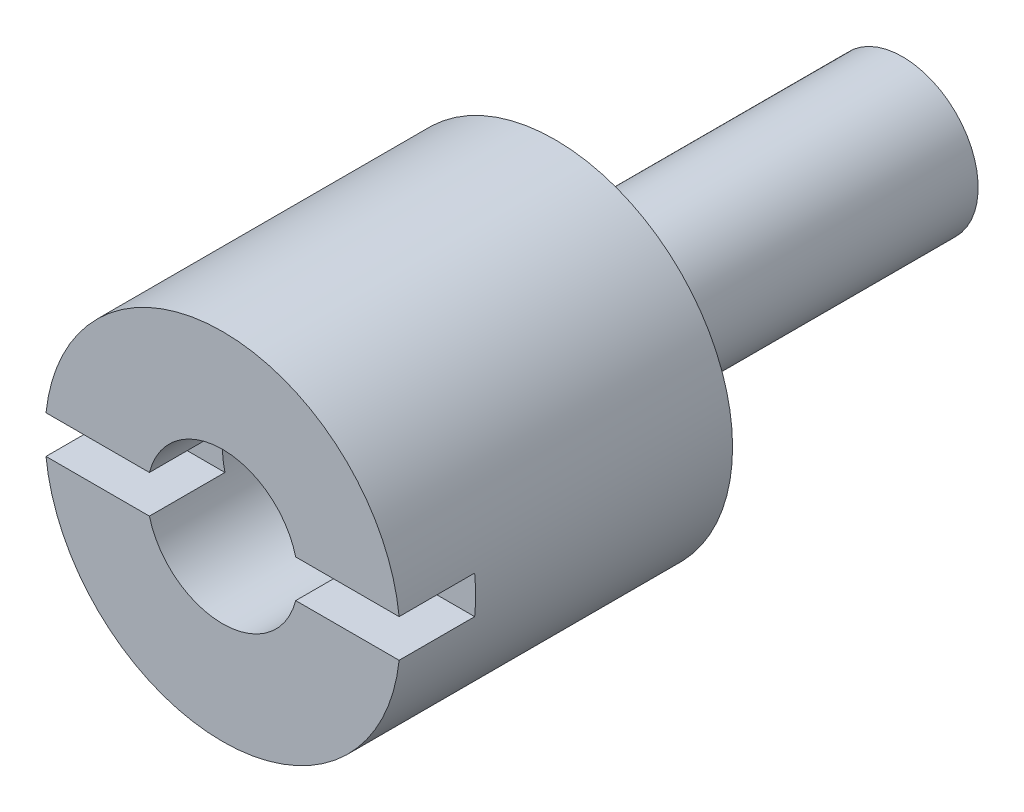
ISO-10303-21;
HEADER;
FILE_DESCRIPTION(('STEP AP214'),'2;1');
FILE_NAME('part.step','',(''),(''),'','','');
FILE_SCHEMA(('AUTOMOTIVE_DESIGN { 1 0 10303 214 1 1 1 1 }'));
ENDSEC;
DATA;
#1=APPLICATION_CONTEXT('core data for automotive mechanical design processes');
#2=APPLICATION_PROTOCOL_DEFINITION('international standard','automotive_design',2000,#1);
#3=PRODUCT_CONTEXT('',#1,'mechanical');
#4=PRODUCT('Part','Part','',(#3));
#5=PRODUCT_RELATED_PRODUCT_CATEGORY('part','',(#4));
#6=PRODUCT_DEFINITION_FORMATION('','',#4);
#7=PRODUCT_DEFINITION_CONTEXT('part definition',#1,'design');
#8=PRODUCT_DEFINITION('design','',#6,#7);
#9=PRODUCT_DEFINITION_SHAPE('','',#8);
#10=(LENGTH_UNIT() NAMED_UNIT(*) SI_UNIT(.MILLI.,.METRE.));
#11=(NAMED_UNIT(*) PLANE_ANGLE_UNIT() SI_UNIT($,.RADIAN.));
#12=(NAMED_UNIT(*) SI_UNIT($,.STERADIAN.) SOLID_ANGLE_UNIT());
#13=UNCERTAINTY_MEASURE_WITH_UNIT(LENGTH_MEASURE(1.E-05),#10,'distance_accuracy_value','');
#14=(GEOMETRIC_REPRESENTATION_CONTEXT(3) GLOBAL_UNCERTAINTY_ASSIGNED_CONTEXT((#13)) GLOBAL_UNIT_ASSIGNED_CONTEXT((#10,
#11,#12)) REPRESENTATION_CONTEXT('',''));
#15=CARTESIAN_POINT('',(0.,0.,0.));
#16=DIRECTION('',(0.,0.,1.));
#17=DIRECTION('',(1.,0.,0.));
#18=AXIS2_PLACEMENT_3D('',#15,#16,#17);
#19=CARTESIAN_POINT('',(0.,0.,-4.6));
#20=DIRECTION('',(0.,0.,1.));
#21=DIRECTION('',(1.,0.,0.));
#22=AXIS2_PLACEMENT_3D('',#19,#20,#21);
#23=CYLINDRICAL_SURFACE('',#22,1.);
#24=CARTESIAN_POINT('',(0.,0.,-4.6));
#25=DIRECTION('',(0.,0.,-1.));
#26=DIRECTION('',(-1.,0.,0.));
#27=AXIS2_PLACEMENT_3D('',#24,#25,#26);
#28=CIRCLE('',#27,1.);
#29=CARTESIAN_POINT('',(-1.,0.,-4.6));
#30=VERTEX_POINT('',#29);
#31=EDGE_CURVE('E11',#30,#30,#28,.T.);
#32=ORIENTED_EDGE('',*,*,#31,.F.);
#33=EDGE_LOOP('',(#32));
#34=FACE_BOUND('',#33,.T.);
#35=CARTESIAN_POINT('',(0.,0.,0.));
#36=DIRECTION('',(0.,0.,-1.));
#37=DIRECTION('',(-1.,0.,0.));
#38=AXIS2_PLACEMENT_3D('',#35,#36,#37);
#39=CIRCLE('',#38,1.);
#40=CARTESIAN_POINT('',(-1.,0.,0.));
#41=VERTEX_POINT('',#40);
#42=EDGE_CURVE('E46',#41,#41,#39,.T.);
#43=ORIENTED_EDGE('',*,*,#42,.T.);
#44=EDGE_LOOP('',(#43));
#45=FACE_BOUND('',#44,.T.);
#46=ADVANCED_FACE('F43',(#34,#45),#23,.T.);
#47=CARTESIAN_POINT('',(0.,0.,-4.6));
#48=DIRECTION('',(0.,0.,-1.));
#49=DIRECTION('',(-1.,0.,0.));
#50=AXIS2_PLACEMENT_3D('',#47,#48,#49);
#51=PLANE('',#50);
#52=ORIENTED_EDGE('',*,*,#31,.T.);
#53=EDGE_LOOP('',(#52));
#54=FACE_BOUND('',#53,.T.);
#55=ADVANCED_FACE('F58',(#54),#51,.T.);
#56=CARTESIAN_POINT('',(0.,0.,0.));
#57=DIRECTION('',(0.,0.,-1.));
#58=DIRECTION('',(-1.,0.,0.));
#59=AXIS2_PLACEMENT_3D('',#56,#57,#58);
#60=PLANE('',#59);
#61=ORIENTED_EDGE('',*,*,#42,.F.);
#62=EDGE_LOOP('',(#61));
#63=FACE_BOUND('',#62,.T.);
#64=ADVANCED_FACE('F56',(#63),#60,.F.);
#65=CLOSED_SHELL('',(#46,#55,#64));
#66=MANIFOLD_SOLID_BREP('B2',#65);
#67=CARTESIAN_POINT('',(0.,0.,4.4));
#68=DIRECTION('',(0.,0.,1.));
#69=DIRECTION('',(1.,0.,0.));
#70=AXIS2_PLACEMENT_3D('',#67,#68,#69);
#71=PLANE('',#70);
#72=DIRECTION('',(-1.,0.,0.));
#73=VECTOR('',#72,1.);
#74=CARTESIAN_POINT('',(-2.5,0.25,4.4));
#75=LINE('',#74,#73);
#76=CARTESIAN_POINT('',(2.33666428910958,0.25,4.4));
#77=VERTEX_POINT('',#76);
#78=CARTESIAN_POINT('',(0.968245836551854,0.25,4.4));
#79=VERTEX_POINT('',#78);
#80=EDGE_CURVE('E210',#77,#79,#75,.T.);
#81=ORIENTED_EDGE('',*,*,#80,.F.);
#82=CARTESIAN_POINT('',(0.,0.,4.4));
#83=DIRECTION('',(0.,0.,1.));
#84=DIRECTION('',(1.,0.,0.));
#85=AXIS2_PLACEMENT_3D('',#82,#83,#84);
#86=CIRCLE('',#85,2.35);
#87=CARTESIAN_POINT('',(-2.33666428910958,0.25,4.4));
#88=VERTEX_POINT('',#87);
#89=EDGE_CURVE('E172',#77,#88,#86,.T.);
#90=ORIENTED_EDGE('',*,*,#89,.T.);
#91=CARTESIAN_POINT('',(-0.968245836551854,0.25,4.4));
#92=VERTEX_POINT('',#91);
#93=EDGE_CURVE('E166',#92,#88,#75,.T.);
#94=ORIENTED_EDGE('',*,*,#93,.F.);
#95=CARTESIAN_POINT('',(0.,0.,4.4));
#96=DIRECTION('',(0.,0.,1.));
#97=DIRECTION('',(1.,0.,0.));
#98=AXIS2_PLACEMENT_3D('',#95,#96,#97);
#99=CIRCLE('',#98,1.);
#100=EDGE_CURVE('E178',#79,#92,#99,.T.);
#101=ORIENTED_EDGE('',*,*,#100,.F.);
#102=EDGE_LOOP('',(#81,#90,#94,#101));
#103=FACE_BOUND('',#102,.T.);
#104=ADVANCED_FACE('F84',(#103),#71,.T.);
#105=DIRECTION('',(1.,0.,0.));
#106=VECTOR('',#105,1.);
#107=CARTESIAN_POINT('',(-2.5,-0.25,4.4));
#108=LINE('',#107,#106);
#109=CARTESIAN_POINT('',(-2.33666428910958,-0.25,4.4));
#110=VERTEX_POINT('',#109);
#111=CARTESIAN_POINT('',(-0.968245836551854,-0.25,4.4));
#112=VERTEX_POINT('',#111);
#113=EDGE_CURVE('E150',#110,#112,#108,.T.);
#114=ORIENTED_EDGE('',*,*,#113,.F.);
#115=CARTESIAN_POINT('',(2.33666428910958,-0.25,4.4));
#116=VERTEX_POINT('',#115);
#117=EDGE_CURVE('E163',#110,#116,#86,.T.);
#118=ORIENTED_EDGE('',*,*,#117,.T.);
#119=CARTESIAN_POINT('',(0.968245836551854,-0.25,4.4));
#120=VERTEX_POINT('',#119);
#121=EDGE_CURVE('E167',#120,#116,#108,.T.);
#122=ORIENTED_EDGE('',*,*,#121,.F.);
#123=EDGE_CURVE('E165',#112,#120,#99,.T.);
#124=ORIENTED_EDGE('',*,*,#123,.F.);
#125=EDGE_LOOP('',(#114,#118,#122,#124));
#126=FACE_BOUND('',#125,.T.);
#127=ADVANCED_FACE('F161',(#126),#71,.T.);
#128=CARTESIAN_POINT('',(0.,0.,0.));
#129=DIRECTION('',(0.,0.,1.));
#130=DIRECTION('',(1.,0.,0.));
#131=AXIS2_PLACEMENT_3D('',#128,#129,#130);
#132=PLANE('',#131);
#133=CARTESIAN_POINT('',(0.,0.,0.));
#134=DIRECTION('',(0.,0.,1.));
#135=DIRECTION('',(1.,0.,0.));
#136=AXIS2_PLACEMENT_3D('',#133,#134,#135);
#137=CIRCLE('',#136,2.35);
#138=CARTESIAN_POINT('',(2.35,0.,0.));
#139=VERTEX_POINT('',#138);
#140=EDGE_CURVE('E173',#139,#139,#137,.T.);
#141=ORIENTED_EDGE('',*,*,#140,.F.);
#142=EDGE_LOOP('',(#141));
#143=FACE_BOUND('',#142,.T.);
#144=CARTESIAN_POINT('',(0.,0.,0.));
#145=DIRECTION('',(0.,0.,1.));
#146=DIRECTION('',(1.,0.,0.));
#147=AXIS2_PLACEMENT_3D('',#144,#145,#146);
#148=CIRCLE('',#147,1.);
#149=CARTESIAN_POINT('',(1.,0.,0.));
#150=VERTEX_POINT('',#149);
#151=EDGE_CURVE('E181',#150,#150,#148,.T.);
#152=ORIENTED_EDGE('',*,*,#151,.T.);
#153=EDGE_LOOP('',(#152));
#154=FACE_BOUND('',#153,.T.);
#155=ADVANCED_FACE('F223',(#143,#154),#132,.F.);
#156=CARTESIAN_POINT('',(0.,0.,4.4));
#157=DIRECTION('',(0.,0.,-1.));
#158=DIRECTION('',(-1.,0.,0.));
#159=AXIS2_PLACEMENT_3D('',#156,#157,#158);
#160=CYLINDRICAL_SURFACE('',#159,2.35);
#161=CARTESIAN_POINT('',(0.,0.,3.4));
#162=DIRECTION('',(0.,0.,1.));
#163=DIRECTION('',(1.,0.,0.));
#164=AXIS2_PLACEMENT_3D('',#161,#162,#163);
#165=CIRCLE('',#164,2.35);
#166=CARTESIAN_POINT('',(-2.33666428910958,0.25,3.4));
#167=VERTEX_POINT('',#166);
#168=CARTESIAN_POINT('',(-2.33666428910958,-0.25,3.4));
#169=VERTEX_POINT('',#168);
#170=EDGE_CURVE('E212',#167,#169,#165,.T.);
#171=ORIENTED_EDGE('',*,*,#170,.F.);
#172=DIRECTION('',(0.,0.,-1.));
#173=VECTOR('',#172,1.);
#174=CARTESIAN_POINT('',(-2.33666428910958,0.25,4.4));
#175=LINE('',#174,#173);
#176=EDGE_CURVE('E155',#167,#88,#175,.F.);
#177=ORIENTED_EDGE('',*,*,#176,.T.);
#178=ORIENTED_EDGE('',*,*,#89,.F.);
#179=DIRECTION('',(0.,0.,-1.));
#180=VECTOR('',#179,1.);
#181=CARTESIAN_POINT('',(2.33666428910958,0.25,4.4));
#182=LINE('',#181,#180);
#183=CARTESIAN_POINT('',(2.33666428910958,0.25,3.4));
#184=VERTEX_POINT('',#183);
#185=EDGE_CURVE('E215',#77,#184,#182,.T.);
#186=ORIENTED_EDGE('',*,*,#185,.T.);
#187=CARTESIAN_POINT('',(2.33666428910958,-0.25,3.4));
#188=VERTEX_POINT('',#187);
#189=EDGE_CURVE('E205',#188,#184,#165,.T.);
#190=ORIENTED_EDGE('',*,*,#189,.F.);
#191=DIRECTION('',(0.,0.,-1.));
#192=VECTOR('',#191,1.);
#193=CARTESIAN_POINT('',(2.33666428910958,-0.25,4.4));
#194=LINE('',#193,#192);
#195=EDGE_CURVE('E156',#188,#116,#194,.F.);
#196=ORIENTED_EDGE('',*,*,#195,.T.);
#197=ORIENTED_EDGE('',*,*,#117,.F.);
#198=DIRECTION('',(0.,0.,-1.));
#199=VECTOR('',#198,1.);
#200=CARTESIAN_POINT('',(-2.33666428910958,-0.25,4.4));
#201=LINE('',#200,#199);
#202=EDGE_CURVE('E147',#110,#169,#201,.T.);
#203=ORIENTED_EDGE('',*,*,#202,.T.);
#204=EDGE_LOOP('',(#171,#177,#178,#186,#190,#196,#197,#203));
#205=FACE_BOUND('',#204,.T.);
#206=ORIENTED_EDGE('',*,*,#140,.T.);
#207=EDGE_LOOP('',(#206));
#208=FACE_BOUND('',#207,.T.);
#209=ADVANCED_FACE('F86',(#205,#208),#160,.T.);
#210=CARTESIAN_POINT('',(0.,0.,4.4));
#211=DIRECTION('',(0.,0.,-1.));
#212=DIRECTION('',(-1.,0.,0.));
#213=AXIS2_PLACEMENT_3D('',#210,#211,#212);
#214=CYLINDRICAL_SURFACE('',#213,1.);
#215=DIRECTION('',(0.,0.,-1.));
#216=VECTOR('',#215,1.);
#217=CARTESIAN_POINT('',(-0.968245836551854,0.25,4.4));
#218=LINE('',#217,#216);
#219=CARTESIAN_POINT('',(-0.968245836551854,0.25,3.4));
#220=VERTEX_POINT('',#219);
#221=EDGE_CURVE('E41',#220,#92,#218,.F.);
#222=ORIENTED_EDGE('',*,*,#221,.F.);
#223=CARTESIAN_POINT('',(0.,0.,3.4));
#224=DIRECTION('',(0.,0.,1.));
#225=DIRECTION('',(1.,0.,0.));
#226=AXIS2_PLACEMENT_3D('',#223,#224,#225);
#227=CIRCLE('',#226,1.);
#228=CARTESIAN_POINT('',(-0.968245836551854,-0.25,3.4));
#229=VERTEX_POINT('',#228);
#230=EDGE_CURVE('E187',#220,#229,#227,.T.);
#231=ORIENTED_EDGE('',*,*,#230,.T.);
#232=DIRECTION('',(0.,0.,-1.));
#233=VECTOR('',#232,1.);
#234=CARTESIAN_POINT('',(-0.968245836551854,-0.25,4.4));
#235=LINE('',#234,#233);
#236=EDGE_CURVE('E92',#112,#229,#235,.T.);
#237=ORIENTED_EDGE('',*,*,#236,.F.);
#238=ORIENTED_EDGE('',*,*,#123,.T.);
#239=DIRECTION('',(0.,0.,-1.));
#240=VECTOR('',#239,1.);
#241=CARTESIAN_POINT('',(0.968245836551854,-0.25,4.4));
#242=LINE('',#241,#240);
#243=CARTESIAN_POINT('',(0.968245836551854,-0.25,3.4));
#244=VERTEX_POINT('',#243);
#245=EDGE_CURVE('E186',#244,#120,#242,.F.);
#246=ORIENTED_EDGE('',*,*,#245,.F.);
#247=CARTESIAN_POINT('',(0.968245836551854,0.25,3.4));
#248=VERTEX_POINT('',#247);
#249=EDGE_CURVE('E176',#244,#248,#227,.T.);
#250=ORIENTED_EDGE('',*,*,#249,.T.);
#251=DIRECTION('',(0.,0.,-1.));
#252=VECTOR('',#251,1.);
#253=CARTESIAN_POINT('',(0.968245836551854,0.25,4.4));
#254=LINE('',#253,#252);
#255=EDGE_CURVE('E189',#79,#248,#254,.T.);
#256=ORIENTED_EDGE('',*,*,#255,.F.);
#257=ORIENTED_EDGE('',*,*,#100,.T.);
#258=EDGE_LOOP('',(#222,#231,#237,#238,#246,#250,#256,#257));
#259=FACE_BOUND('',#258,.T.);
#260=ORIENTED_EDGE('',*,*,#151,.F.);
#261=EDGE_LOOP('',(#260));
#262=FACE_BOUND('',#261,.T.);
#263=ADVANCED_FACE('F193',(#259,#262),#214,.F.);
#264=CARTESIAN_POINT('',(0.,0.,3.4));
#265=DIRECTION('',(0.,0.,1.));
#266=DIRECTION('',(1.,0.,0.));
#267=AXIS2_PLACEMENT_3D('',#264,#265,#266);
#268=PLANE('',#267);
#269=ORIENTED_EDGE('',*,*,#189,.T.);
#270=DIRECTION('',(-1.,0.,0.));
#271=VECTOR('',#270,1.);
#272=CARTESIAN_POINT('',(-2.5,0.25,3.4));
#273=LINE('',#272,#271);
#274=EDGE_CURVE('E107',#184,#248,#273,.T.);
#275=ORIENTED_EDGE('',*,*,#274,.T.);
#276=ORIENTED_EDGE('',*,*,#249,.F.);
#277=DIRECTION('',(1.,0.,0.));
#278=VECTOR('',#277,1.);
#279=CARTESIAN_POINT('',(-2.5,-0.25,3.4));
#280=LINE('',#279,#278);
#281=EDGE_CURVE('E206',#244,#188,#280,.T.);
#282=ORIENTED_EDGE('',*,*,#281,.T.);
#283=EDGE_LOOP('',(#269,#275,#276,#282));
#284=FACE_BOUND('',#283,.T.);
#285=ADVANCED_FACE('F225',(#284),#268,.T.);
#286=CARTESIAN_POINT('',(-2.5,-0.25,3.4));
#287=DIRECTION('',(0.,-1.,0.));
#288=DIRECTION('',(0.,0.,-1.));
#289=AXIS2_PLACEMENT_3D('',#286,#287,#288);
#290=PLANE('',#289);
#291=ORIENTED_EDGE('',*,*,#281,.F.);
#292=ORIENTED_EDGE('',*,*,#245,.T.);
#293=ORIENTED_EDGE('',*,*,#121,.T.);
#294=ORIENTED_EDGE('',*,*,#195,.F.);
#295=EDGE_LOOP('',(#291,#292,#293,#294));
#296=FACE_BOUND('',#295,.T.);
#297=ADVANCED_FACE('F231',(#296),#290,.F.);
#298=CARTESIAN_POINT('',(-2.5,0.25,3.4));
#299=DIRECTION('',(0.,1.,0.));
#300=DIRECTION('',(0.,0.,1.));
#301=AXIS2_PLACEMENT_3D('',#298,#299,#300);
#302=PLANE('',#301);
#303=ORIENTED_EDGE('',*,*,#80,.T.);
#304=ORIENTED_EDGE('',*,*,#255,.T.);
#305=ORIENTED_EDGE('',*,*,#274,.F.);
#306=ORIENTED_EDGE('',*,*,#185,.F.);
#307=EDGE_LOOP('',(#303,#304,#305,#306));
#308=FACE_BOUND('',#307,.T.);
#309=ADVANCED_FACE('F274',(#308),#302,.F.);
#310=EDGE_CURVE('E199',#220,#167,#273,.T.);
#311=ORIENTED_EDGE('',*,*,#310,.F.);
#312=ORIENTED_EDGE('',*,*,#221,.T.);
#313=ORIENTED_EDGE('',*,*,#93,.T.);
#314=ORIENTED_EDGE('',*,*,#176,.F.);
#315=EDGE_LOOP('',(#311,#312,#313,#314));
#316=FACE_BOUND('',#315,.T.);
#317=ADVANCED_FACE('F201',(#316),#302,.F.);
#318=ORIENTED_EDGE('',*,*,#113,.T.);
#319=ORIENTED_EDGE('',*,*,#236,.T.);
#320=EDGE_CURVE('E99',#169,#229,#280,.T.);
#321=ORIENTED_EDGE('',*,*,#320,.F.);
#322=ORIENTED_EDGE('',*,*,#202,.F.);
#323=EDGE_LOOP('',(#318,#319,#321,#322));
#324=FACE_BOUND('',#323,.T.);
#325=ADVANCED_FACE('F149',(#324),#290,.F.);
#326=ORIENTED_EDGE('',*,*,#170,.T.);
#327=ORIENTED_EDGE('',*,*,#320,.T.);
#328=ORIENTED_EDGE('',*,*,#230,.F.);
#329=ORIENTED_EDGE('',*,*,#310,.T.);
#330=EDGE_LOOP('',(#326,#327,#328,#329));
#331=FACE_BOUND('',#330,.T.);
#332=ADVANCED_FACE('F198',(#331),#268,.T.);
#333=CLOSED_SHELL('',(#104,#127,#155,#209,#263,#285,#297,#309,#317,#325,#332));
#334=MANIFOLD_SOLID_BREP('B6',#333);
#335=ADVANCED_BREP_SHAPE_REPRESENTATION('',(#18,#66,#334),#14);
#336=SHAPE_DEFINITION_REPRESENTATION(#9,#335);
ENDSEC;
END-ISO-10303-21;
